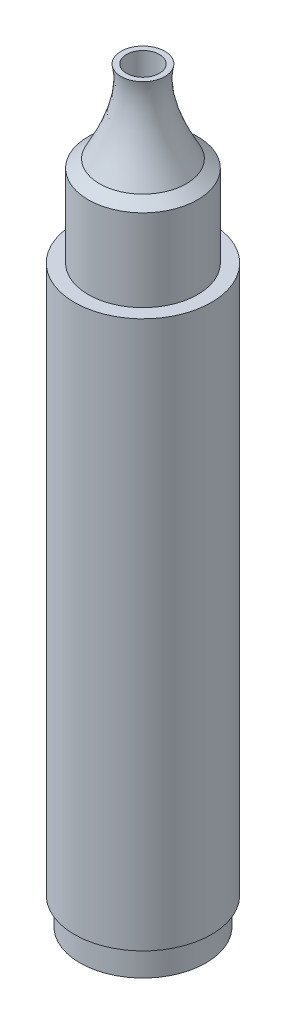
ISO-10303-21;
HEADER;
FILE_DESCRIPTION(('STEP AP214'),'2;1');
FILE_NAME('part.step','',(''),(''),'','','');
FILE_SCHEMA(('AUTOMOTIVE_DESIGN { 1 0 10303 214 1 1 1 1 }'));
ENDSEC;
DATA;
#1=APPLICATION_CONTEXT('core data for automotive mechanical design processes');
#2=APPLICATION_PROTOCOL_DEFINITION('international standard','automotive_design',2000,#1);
#3=PRODUCT_CONTEXT('',#1,'mechanical');
#4=PRODUCT('Part','Part','',(#3));
#5=PRODUCT_RELATED_PRODUCT_CATEGORY('part','',(#4));
#6=PRODUCT_DEFINITION_FORMATION('','',#4);
#7=PRODUCT_DEFINITION_CONTEXT('part definition',#1,'design');
#8=PRODUCT_DEFINITION('design','',#6,#7);
#9=PRODUCT_DEFINITION_SHAPE('','',#8);
#10=(LENGTH_UNIT() NAMED_UNIT(*) SI_UNIT(.MILLI.,.METRE.));
#11=(NAMED_UNIT(*) PLANE_ANGLE_UNIT() SI_UNIT($,.RADIAN.));
#12=(NAMED_UNIT(*) SI_UNIT($,.STERADIAN.) SOLID_ANGLE_UNIT());
#13=UNCERTAINTY_MEASURE_WITH_UNIT(LENGTH_MEASURE(1.E-05),#10,'distance_accuracy_value','');
#14=(GEOMETRIC_REPRESENTATION_CONTEXT(3) GLOBAL_UNCERTAINTY_ASSIGNED_CONTEXT((#13)) GLOBAL_UNIT_ASSIGNED_CONTEXT((#10,
#11,#12)) REPRESENTATION_CONTEXT('',''));
#15=CARTESIAN_POINT('',(0.,0.,0.));
#16=DIRECTION('',(0.,0.,1.));
#17=DIRECTION('',(1.,0.,0.));
#18=AXIS2_PLACEMENT_3D('',#15,#16,#17);
#19=CARTESIAN_POINT('',(0.,46.5,0.));
#20=DIRECTION('',(0.,1.,0.));
#21=DIRECTION('',(0.,0.,1.));
#22=AXIS2_PLACEMENT_3D('',#19,#20,#21);
#23=CYLINDRICAL_SURFACE('',#22,3.);
#24=CARTESIAN_POINT('',(0.,81.5,0.));
#25=DIRECTION('',(0.,1.,0.));
#26=DIRECTION('',(0.,0.,1.));
#27=AXIS2_PLACEMENT_3D('',#24,#25,#26);
#28=CIRCLE('',#27,3.);
#29=CARTESIAN_POINT('',(0.,81.5,3.));
#30=VERTEX_POINT('',#29);
#31=EDGE_CURVE('E152',#30,#30,#28,.T.);
#32=ORIENTED_EDGE('',*,*,#31,.T.);
#33=EDGE_LOOP('',(#32));
#34=FACE_BOUND('',#33,.T.);
#35=CARTESIAN_POINT('',(0.,50.,0.));
#36=DIRECTION('',(0.,-1.,0.));
#37=DIRECTION('',(0.,0.,-1.));
#38=AXIS2_PLACEMENT_3D('',#35,#36,#37);
#39=CIRCLE('',#38,3.);
#40=CARTESIAN_POINT('',(0.,50.,-3.));
#41=VERTEX_POINT('',#40);
#42=EDGE_CURVE('E107',#41,#41,#39,.F.);
#43=ORIENTED_EDGE('',*,*,#42,.F.);
#44=EDGE_LOOP('',(#43));
#45=FACE_BOUND('',#44,.T.);
#46=ADVANCED_FACE('F78',(#34,#45),#23,.F.);
#47=CARTESIAN_POINT('',(0.,50.,0.));
#48=DIRECTION('',(0.,-1.,0.));
#49=DIRECTION('',(0.,0.,-1.));
#50=AXIS2_PLACEMENT_3D('',#47,#48,#49);
#51=CYLINDRICAL_SURFACE('',#50,12.5);
#52=CARTESIAN_POINT('',(0.,50.,0.));
#53=DIRECTION('',(0.,1.,0.));
#54=DIRECTION('',(0.,0.,1.));
#55=AXIS2_PLACEMENT_3D('',#52,#53,#54);
#56=CIRCLE('',#55,12.5);
#57=CARTESIAN_POINT('',(0.,50.,12.5));
#58=VERTEX_POINT('',#57);
#59=EDGE_CURVE('E85',#58,#58,#56,.T.);
#60=ORIENTED_EDGE('',*,*,#59,.F.);
#61=EDGE_LOOP('',(#60));
#62=FACE_BOUND('',#61,.T.);
#63=CARTESIAN_POINT('',(0.,-50.,0.));
#64=DIRECTION('',(0.,1.,0.));
#65=DIRECTION('',(0.,0.,1.));
#66=AXIS2_PLACEMENT_3D('',#63,#64,#65);
#67=CIRCLE('',#66,12.5);
#68=CARTESIAN_POINT('',(0.,-50.,12.5));
#69=VERTEX_POINT('',#68);
#70=EDGE_CURVE('E89',#69,#69,#67,.T.);
#71=ORIENTED_EDGE('',*,*,#70,.T.);
#72=EDGE_LOOP('',(#71));
#73=FACE_BOUND('',#72,.T.);
#74=ADVANCED_FACE('F80',(#62,#73),#51,.T.);
#75=CARTESIAN_POINT('',(0.,50.,0.));
#76=DIRECTION('',(0.,1.,0.));
#77=DIRECTION('',(0.,0.,1.));
#78=AXIS2_PLACEMENT_3D('',#75,#76,#77);
#79=PLANE('',#78);
#80=CARTESIAN_POINT('',(0.,50.,0.));
#81=DIRECTION('',(0.,1.,0.));
#82=DIRECTION('',(0.,0.,1.));
#83=AXIS2_PLACEMENT_3D('',#80,#81,#82);
#84=CIRCLE('',#83,10.);
#85=CARTESIAN_POINT('',(0.,50.,10.));
#86=VERTEX_POINT('',#85);
#87=EDGE_CURVE('E97',#86,#86,#84,.T.);
#88=ORIENTED_EDGE('',*,*,#87,.F.);
#89=EDGE_LOOP('',(#88));
#90=FACE_BOUND('',#89,.T.);
#91=ORIENTED_EDGE('',*,*,#59,.T.);
#92=EDGE_LOOP('',(#91));
#93=FACE_BOUND('',#92,.T.);
#94=ADVANCED_FACE('F162',(#90,#93),#79,.T.);
#95=CARTESIAN_POINT('',(0.,-50.,0.));
#96=DIRECTION('',(0.,1.,0.));
#97=DIRECTION('',(0.,0.,1.));
#98=AXIS2_PLACEMENT_3D('',#95,#96,#97);
#99=PLANE('',#98);
#100=CARTESIAN_POINT('',(0.,-50.,0.));
#101=DIRECTION('',(0.,1.,0.));
#102=DIRECTION('',(0.,0.,1.));
#103=AXIS2_PLACEMENT_3D('',#100,#101,#102);
#104=CIRCLE('',#103,11.5);
#105=CARTESIAN_POINT('',(0.,-50.,11.5));
#106=VERTEX_POINT('',#105);
#107=EDGE_CURVE('E11',#106,#106,#104,.F.);
#108=ORIENTED_EDGE('',*,*,#107,.F.);
#109=EDGE_LOOP('',(#108));
#110=FACE_BOUND('',#109,.T.);
#111=ORIENTED_EDGE('',*,*,#70,.F.);
#112=EDGE_LOOP('',(#111));
#113=FACE_BOUND('',#112,.T.);
#114=ADVANCED_FACE('F164',(#110,#113),#99,.F.);
#115=CARTESIAN_POINT('',(0.,65.,0.));
#116=DIRECTION('',(0.,-1.,0.));
#117=DIRECTION('',(0.,0.,-1.));
#118=AXIS2_PLACEMENT_3D('',#115,#116,#117);
#119=CYLINDRICAL_SURFACE('',#118,10.);
#120=CARTESIAN_POINT('',(0.,65.,0.));
#121=DIRECTION('',(0.,1.,0.));
#122=DIRECTION('',(0.,0.,1.));
#123=AXIS2_PLACEMENT_3D('',#120,#121,#122);
#124=CIRCLE('',#123,10.);
#125=CARTESIAN_POINT('',(0.,65.,10.));
#126=VERTEX_POINT('',#125);
#127=EDGE_CURVE('E94',#126,#126,#124,.T.);
#128=ORIENTED_EDGE('',*,*,#127,.F.);
#129=EDGE_LOOP('',(#128));
#130=FACE_BOUND('',#129,.T.);
#131=ORIENTED_EDGE('',*,*,#87,.T.);
#132=EDGE_LOOP('',(#131));
#133=FACE_BOUND('',#132,.T.);
#134=ADVANCED_FACE('F160',(#130,#133),#119,.T.);
#135=CARTESIAN_POINT('',(0.,65.,0.));
#136=DIRECTION('',(0.,-1.,0.));
#137=DIRECTION('',(0.,0.,1.));
#138=AXIS2_PLACEMENT_3D('',#135,#136,#137);
#139=CONICAL_SURFACE('',#138,10.,0.942477796076939);
#140=CARTESIAN_POINT('',(5.60091406784511,66.4996844240338,-5.62206891748112));
#141=CARTESIAN_POINT('',(5.7591145441094,66.4996853382492,-5.46446421795488));
#142=CARTESIAN_POINT('',(5.9105040578577,66.4998265845282,-5.30005710016583));
#143=CARTESIAN_POINT('',(6.19895446938598,66.5000943482111,-4.95901121993968));
#144=CARTESIAN_POINT('',(6.33600997109026,66.5002208600702,-4.78236789245139));
#145=CARTESIAN_POINT('',(6.5950597171091,66.5003173375481,-4.41806353572599));
#146=CARTESIAN_POINT('',(6.71703603029525,66.5002871185922,-4.2303897736038));
#147=CARTESIAN_POINT('',(6.94485061121303,66.5001007442931,-3.84549548560347));
#148=CARTESIAN_POINT('',(7.05069173449653,66.4999446112645,-3.64827665713771));
#149=CARTESIAN_POINT('',(7.19661051800619,66.4997615489761,-3.34627075603501));
#150=CARTESIAN_POINT('',(7.24311906990382,66.4997090447501,-3.2445478238334));
#151=CARTESIAN_POINT('',(7.33171003320905,66.4996724322933,-3.03919262868534));
#152=CARTESIAN_POINT('',(7.37379246663426,66.4996883237222,-2.93556037523978));
#153=CARTESIAN_POINT('',(7.49332624256314,66.4998017968305,-2.62209669151953));
#154=CARTESIAN_POINT('',(7.56407809629994,66.4999651629713,-2.40966926897839));
#155=CARTESIAN_POINT('',(7.68747352367586,66.5002013768243,-1.97973975545691));
#156=CARTESIAN_POINT('',(7.74012375339314,66.5002742578342,-1.76223956124743));
#157=CARTESIAN_POINT('',(7.82709651023273,66.5002571539108,-1.32360738337499));
#158=CARTESIAN_POINT('',(7.86141924265363,66.5001671708018,-1.10247544042227));
#159=CARTESIAN_POINT('',(7.91132927635797,66.4999085315042,-0.658521822133398));
#160=CARTESIAN_POINT('',(7.92695410868064,66.4997400338609,-0.435704438147747));
#161=CARTESIAN_POINT('',(7.93606424311948,66.4996390938655,-0.101146418016441));
#162=CARTESIAN_POINT('',(7.93671256219778,66.499630753879,0.0104375058428037));
#163=CARTESIAN_POINT('',(7.93321673210212,66.4996788835062,0.233530553281766));
#164=CARTESIAN_POINT('',(7.9290725453627,66.4997353536278,0.345039676268311));
#165=CARTESIAN_POINT('',(7.90956046111363,66.4999258365794,0.679136457867865));
#166=CARTESIAN_POINT('',(7.88711450339323,66.500080939622,0.901349285266981));
#167=CARTESIAN_POINT('',(7.823754085219,66.5002622320344,1.34311723336023));
#168=CARTESIAN_POINT('',(7.78283755479337,66.5002884069514,1.56267205334259));
#169=CARTESIAN_POINT('',(7.68293511363978,66.5001866474977,1.99726279104118));
#170=CARTESIAN_POINT('',(7.62397886364519,66.5000589650927,2.21230551189636));
#171=CARTESIAN_POINT('',(7.48819265754146,66.4998021709668,2.63664829293196));
#172=CARTESIAN_POINT('',(7.41136532103142,66.4996730594581,2.84594918974475));
#173=CARTESIAN_POINT('',(7.24003038713968,66.4996928972499,3.25719093338214));
#174=CARTESIAN_POINT('',(7.14552227395217,66.4998418546637,3.45913156527844));
#175=CARTESIAN_POINT('',(6.93989009134385,66.5001088167002,3.85437155371327));
#176=CARTESIAN_POINT('',(6.82876502173701,66.5002268194586,4.04767038918577));
#177=CARTESIAN_POINT('',(6.59086421165636,66.5003062643202,4.42429964702583));
#178=CARTESIAN_POINT('',(6.4640927865921,66.5002677494992,4.60763279801652));
#179=CARTESIAN_POINT('',(6.1957006313774,66.5000711688183,4.9630953975899));
#180=CARTESIAN_POINT('',(6.05408174330833,66.4999131177738,5.13522623172667));
#181=CARTESIAN_POINT('',(5.83114756062265,66.4997363116131,5.38394770418094));
#182=CARTESIAN_POINT('',(5.75507313079763,66.4996874185148,5.46528709077041));
#183=CARTESIAN_POINT('',(5.59950350622633,66.4996602846937,5.62462284891057));
#184=CARTESIAN_POINT('',(5.52000839049419,66.4996820423396,5.70261929759654));
#185=CARTESIAN_POINT('',(5.27664068954301,66.499809332261,5.93142460479392));
#186=CARTESIAN_POINT('',(5.10786444102137,66.4999768700166,6.07707318181881));
#187=CARTESIAN_POINT('',(4.75874423859713,66.5002199991428,6.35375328074349));
#188=CARTESIAN_POINT('',(4.57839915303029,66.500295581504,6.48478336921742));
#189=CARTESIAN_POINT('',(4.20744690697763,66.5002838998007,6.73140394466579));
#190=CARTESIAN_POINT('',(4.01683985116027,66.5001966373968,6.84699458907524));
#191=CARTESIAN_POINT('',(3.62657973410753,66.4999432130856,7.06185300708897));
#192=CARTESIAN_POINT('',(3.42692601848646,66.4997770454625,7.1611195974889));
#193=CARTESIAN_POINT('',(3.1216918925127,66.4996795266755,7.29694860067313));
#194=CARTESIAN_POINT('',(3.01897930415511,66.499672315012,7.3400495553072));
#195=CARTESIAN_POINT('',(2.81180172802131,66.499720043337,7.42181193296226));
#196=CARTESIAN_POINT('',(2.70733672556573,66.4997749838465,7.46047331877321));
#197=CARTESIAN_POINT('',(2.39132810240221,66.4999586560924,7.56988646589907));
#198=CARTESIAN_POINT('',(2.17742885718066,66.5001061470163,7.63395269183543));
#199=CARTESIAN_POINT('',(1.74503926839508,66.5002709406097,7.74401153841586));
#200=CARTESIAN_POINT('',(1.52654841769384,66.500288228822,7.79000215146038));
#201=CARTESIAN_POINT('',(1.08647425073612,66.5001705608293,7.86362628622693));
#202=CARTESIAN_POINT('',(0.864890777365397,66.5000355968614,7.89125887181623));
#203=CARTESIAN_POINT('',(0.420204874269062,66.4997713353811,7.92774799910688));
#204=CARTESIAN_POINT('',(0.197102666956686,66.4996420370588,7.93660723317953));
#205=CARTESIAN_POINT('',(-0.249517758509706,66.4996625395985,7.93511763275345));
#206=CARTESIAN_POINT('',(-0.473035836691735,66.4998129427161,7.92472735021253));
#207=CARTESIAN_POINT('',(-0.918406973002969,66.500076529376,7.88516607179711));
#208=CARTESIAN_POINT('',(-1.14025992802748,66.5001897106319,7.85599392249524));
#209=CARTESIAN_POINT('',(-1.58075169014647,66.5002579449529,7.77924041918664));
#210=CARTESIAN_POINT('',(-1.79939046986408,66.500212996672,7.73165890847165));
#211=CARTESIAN_POINT('',(-2.23192138589389,66.5000089517572,7.61835224597021));
#212=CARTESIAN_POINT('',(-2.4458141325783,66.4998498698905,7.55262944206121));
#213=CARTESIAN_POINT('',(-2.7618880408733,66.4996858032014,7.44058864148263));
#214=CARTESIAN_POINT('',(-2.86648910425467,66.4996435385239,7.40098203203371));
#215=CARTESIAN_POINT('',(-3.07388133575936,66.4996352025511,7.31728978085394));
#216=CARTESIAN_POINT('',(-3.17667254412099,66.4996691295595,7.27320423885063));
#217=CARTESIAN_POINT('',(-3.48208126231317,66.4998333057142,7.13440589360862));
#218=CARTESIAN_POINT('',(-3.68176330231728,66.5000259420607,7.03314092145615));
#219=CARTESIAN_POINT('',(-4.07188510909359,66.5003220740096,6.81423234672576));
#220=CARTESIAN_POINT('',(-4.26232528943111,66.5004255736042,6.69658947795784));
#221=CARTESIAN_POINT('',(-4.63272159995574,66.5004692151503,6.44582523339415));
#222=CARTESIAN_POINT('',(-4.81267792399972,66.5004093601233,6.31270414394244));
#223=CARTESIAN_POINT('',(-5.16034342353349,66.5002069126255,6.03217076244711));
#224=CARTESIAN_POINT('',(-5.32808376829901,66.5000645396679,5.88479724782035));
#225=CARTESIAN_POINT('',(-5.56975518594777,66.4999964618234,5.65343771695007));
#226=CARTESIAN_POINT('',(-5.64866230595556,66.4999980226724,5.57459394879231));
#227=CARTESIAN_POINT('',(-5.80303347123787,66.5000516734901,5.41360458110039));
#228=CARTESIAN_POINT('',(-5.87849748861126,66.5001037638683,5.33145895481979));
#229=CARTESIAN_POINT('',(-6.0995628974415,66.5002664508266,5.08037628628315));
#230=CARTESIAN_POINT('',(-6.23988953821839,66.5003834925636,4.90674367947948));
#231=CARTESIAN_POINT('',(-6.50557528255518,66.500475043783,4.54839427914648));
#232=CARTESIAN_POINT('',(-6.6309328728887,66.5004495388678,4.36367636783124));
#233=CARTESIAN_POINT('',(-6.8658540778535,66.5002513390043,3.98438548783149));
#234=CARTESIAN_POINT('',(-6.97541405552374,66.5000786102249,3.7898102636636));
#235=CARTESIAN_POINT('',(-7.17769764423607,66.4997687744057,3.39211921879558));
#236=CARTESIAN_POINT('',(-7.27042362098109,66.4996316623594,3.18900460309532));
#237=CARTESIAN_POINT('',(-7.43805824716297,66.4996493976187,2.77555623076929));
#238=CARTESIAN_POINT('',(-7.51296707710465,66.4998042419663,2.56522254730432));
#239=CARTESIAN_POINT('',(-7.64486299031895,66.5000729219536,2.13898498315447));
#240=CARTESIAN_POINT('',(-7.70184736979923,66.5001867514067,1.92308026742364));
#241=CARTESIAN_POINT('',(-7.79751234689577,66.5002580668331,1.48784772505692));
#242=CARTESIAN_POINT('',(-7.83623993911061,66.5002159567135,1.26853020503904));
#243=CARTESIAN_POINT('',(-7.8952821263363,66.5000174583923,0.82742548864063));
#244=CARTESIAN_POINT('',(-7.91559916675671,66.499861085373,0.605638624217256));
#245=CARTESIAN_POINT('',(-7.93194861534551,66.4996993104151,0.272310664298952));
#246=CARTESIAN_POINT('',(-7.9350435272698,66.4996575154427,0.161077889935226));
#247=CARTESIAN_POINT('',(-7.93645613096223,66.4996462333445,-0.0614179710258914));
#248=CARTESIAN_POINT('',(-7.93477383148396,66.4996767460862,-0.172681057567367));
#249=CARTESIAN_POINT('',(-7.92263650875884,66.4998196889534,-0.506218599356346));
#250=CARTESIAN_POINT('',(-7.90509259510209,66.4999835177935,-0.728272953436864));
#251=CARTESIAN_POINT('',(-7.85151733563519,66.500212493124,-1.17033033321901));
#252=CARTESIAN_POINT('',(-7.81546761815298,66.5002775412953,-1.39033109881399));
#253=CARTESIAN_POINT('',(-7.72520752145986,66.5002483936348,-1.82657013854665));
#254=CARTESIAN_POINT('',(-7.67099755219411,66.5001542013975,-2.0428084975001));
#255=CARTESIAN_POINT('',(-7.54464650991213,66.4999007461533,-2.47003865849983));
#256=CARTESIAN_POINT('',(-7.47250403112207,66.4997414780443,-2.68103004779604));
#257=CARTESIAN_POINT('',(-7.35098221391389,66.499673180059,-2.99226003974664));
#258=CARTESIAN_POINT('',(-7.3082524476019,66.4996788563445,-3.09513627686821));
#259=CARTESIAN_POINT('',(-7.21843275334775,66.499745857756,-3.29896768403833));
#260=CARTESIAN_POINT('',(-7.17134278655687,66.4998071833778,-3.39992283696064));
#261=CARTESIAN_POINT('',(-7.02363665972135,66.5000031213156,-3.69988640723402));
#262=CARTESIAN_POINT('',(-6.91665791965379,66.5001496052638,-3.89580485668582));
#263=CARTESIAN_POINT('',(-6.68674618707552,66.5003034360181,-4.27803258808553));
#264=CARTESIAN_POINT('',(-6.56381157545815,66.5003107686927,-4.46434089216845));
#265=CARTESIAN_POINT('',(-6.30284219994142,66.500173424761,-4.82608867491291));
#266=CARTESIAN_POINT('',(-6.16480679556547,66.5000287417049,-5.00152769207587));
#267=CARTESIAN_POINT('',(-5.87443497920085,66.4997680472388,-5.34011385364277));
#268=CARTESIAN_POINT('',(-5.72210056362716,66.4996520318344,-5.50326270827156));
#269=CARTESIAN_POINT('',(-5.40362740343278,66.4996970368878,-5.81621744172798));
#270=CARTESIAN_POINT('',(-5.23745871433711,66.4998586739864,-5.96599284190109));
#271=CARTESIAN_POINT('',(-4.89309752713868,66.5001309320631,-6.2510566628087));
#272=CARTESIAN_POINT('',(-4.71490317982262,66.5002415451746,-6.38634284719059));
#273=CARTESIAN_POINT('',(-4.34785630268588,66.5003039404929,-6.64157232835317));
#274=CARTESIAN_POINT('',(-4.15900381280102,66.5002557232947,-6.76151568261763));
#275=CARTESIAN_POINT('',(-3.77191361124875,66.5000468505546,-6.98516916109));
#276=CARTESIAN_POINT('',(-3.57367716178603,66.4998862100946,-7.08888146044697));
#277=CARTESIAN_POINT('',(-3.2702010147941,66.4997256982868,-7.23154929202932));
#278=CARTESIAN_POINT('',(-3.16796168350263,66.4996856026248,-7.27697746960016));
#279=CARTESIAN_POINT('',(-2.96161772527312,66.4996787893386,-7.36337909015725));
#280=CARTESIAN_POINT('',(-2.85751309938622,66.4997120716731,-7.40435253565376));
#281=CARTESIAN_POINT('',(-2.54271079697558,66.4998585732858,-7.52055417671518));
#282=CARTESIAN_POINT('',(-2.32949669795713,66.5000184434857,-7.5890768178004));
#283=CARTESIAN_POINT('',(-1.89813066136552,66.5002308491336,-7.7079912023762));
#284=CARTESIAN_POINT('',(-1.67997921801279,66.5002833952772,-7.75838475210337));
#285=CARTESIAN_POINT('',(-1.24023044296721,66.5002293777663,-7.84078150453935));
#286=CARTESIAN_POINT('',(-1.01863323211878,66.5001228196794,-7.87278535069497));
#287=CARTESIAN_POINT('',(-0.574016575630578,66.4998485719535,-7.91799458443638));
#288=CARTESIAN_POINT('',(-0.351001371671045,66.4996810183518,-7.93124148636984));
#289=CARTESIAN_POINT('',(0.0953395341605491,66.4996180750387,-7.93851824483944));
#290=CARTESIAN_POINT('',(0.318665226464053,66.499722677118,-7.93254868101366));
#291=CARTESIAN_POINT('',(0.764032953787446,66.4999781170766,-7.90174483026842));
#292=CARTESIAN_POINT('',(0.986074791485171,66.5001289618803,-7.87690771728392));
#293=CARTESIAN_POINT('',(1.42732656063888,66.5002832704799,-7.80880229522759));
#294=CARTESIAN_POINT('',(1.64653628805385,66.5002867237153,-7.76553266571998));
#295=CARTESIAN_POINT('',(2.0803032038946,66.5001457408847,-7.66093122854478));
#296=CARTESIAN_POINT('',(2.29486610096011,66.5000014981852,-7.59962311202191));
#297=CARTESIAN_POINT('',(2.71804582953167,66.4997588076471,-7.45910194286253));
#298=CARTESIAN_POINT('',(2.92666297394793,66.4996603573943,-7.37988983443539));
#299=CARTESIAN_POINT('',(3.33611419893469,66.4997285008074,-7.20394838168585));
#300=CARTESIAN_POINT('',(3.53695625232518,66.499894815182,-7.10723759148258));
#301=CARTESIAN_POINT('',(3.92978748742622,66.5001637716961,-6.89737567006175));
#302=CARTESIAN_POINT('',(4.12177813622267,66.5002664244227,-6.78422727631202));
#303=CARTESIAN_POINT('',(4.54138980540214,66.500313554709,-6.51280784578172));
#304=CARTESIAN_POINT('',(4.76626387883413,66.5002132887,-6.35026509785265));
#305=CARTESIAN_POINT('',(5.19789053656137,66.4998981535069,-6.00266055991615));
#306=CARTESIAN_POINT('',(5.40464398954863,66.4996832898201,-5.81759985042364));
#307=CARTESIAN_POINT('',(5.60091406784511,66.4996844240338,-5.62206891748112));
#308=B_SPLINE_CURVE_WITH_KNOTS('',3,(#140,#141,#142,#143,#144,#145,#146,#147,#148,#149,#150,
#151,#152,#153,#154,#155,#156,#157,#158,#159,#160,#161,#162,#163,#164,#165,#166,#167,#168,#169,
#170,#171,#172,#173,#174,#175,#176,#177,#178,#179,#180,#181,#182,#183,#184,#185,#186,#187,#188,
#189,#190,#191,#192,#193,#194,#195,#196,#197,#198,#199,#200,#201,#202,#203,#204,#205,#206,#207,
#208,#209,#210,#211,#212,#213,#214,#215,#216,#217,#218,#219,#220,#221,#222,#223,#224,#225,#226,
#227,#228,#229,#230,#231,#232,#233,#234,#235,#236,#237,#238,#239,#240,#241,#242,#243,#244,#245,
#246,#247,#248,#249,#250,#251,#252,#253,#254,#255,#256,#257,#258,#259,#260,#261,#262,#263,#264,
#265,#266,#267,#268,#269,#270,#271,#272,#273,#274,#275,#276,#277,#278,#279,#280,#281,#282,#283,
#284,#285,#286,#287,#288,#289,#290,#291,#292,#293,#294,#295,#296,#297,#298,#299,#300,#301,#302,
#303,#304,#305,#306,#307),.UNSPECIFIED.,.T.,.F.,(4,2,2,2,2,2,2,2,2,2,2,2,2,2,2,2,2,2,2,2,2,2,2,
2,2,2,2,2,2,2,2,2,2,2,2,2,2,2,2,2,2,2,2,2,2,2,2,2,2,2,2,2,2,2,2,2,2,2,2,2,2,2,2,2,2,2,2,2,2,2,2,
2,2,2,2,2,2,2,2,2,2,2,2,4),(0.,0.669688548150085,1.33962830163774,2.0103571909175,
2.68096723869655,3.01643033440647,3.35189176128431,4.02271809958189,4.69329750644624,
5.36386940154381,6.03309303283826,6.36776031527755,6.70243022098407,7.37160325358462,
8.04085129811557,8.70900483100335,9.37706048552979,10.0451356324542,10.713251007479,
11.3811825201774,12.0490312624095,12.383054712931,12.7170704520092,13.3850065055847,
14.0530079966285,14.7210026755845,15.3890457509846,15.723123954516,16.0572049579044,
16.7262110103299,17.3952913460986,18.0644057977294,18.7334242821319,19.4038849710556,
20.0743868380737,20.7448944128123,21.4153152499591,21.7507705579493,22.0862183983548,
22.7570206824554,23.4277929209952,24.0985527523534,24.7675363723124,25.1020869871245,
25.4366403124815,26.1055319473334,26.7744911435261,27.4436041039128,28.1126229601173,
28.7816350382288,29.4507479843283,30.1181290403008,30.7854214373692,31.1191604528959,
31.4528988568918,32.1202810166161,32.7883270062469,33.4563579165832,34.1244412120413,
34.458543445356,34.7926486557577,35.4614630614155,36.1303453875083,36.7992560942103,
37.4680735467287,38.1383783025248,38.8087863685373,39.4791919227118,40.1495075577148,
40.4850503144123,40.8205928820284,41.4915855409789,42.1625113291001,42.8334136404236,
43.5028287243407,44.1722236164676,44.841718793299,45.5112619383001,46.1799296234088,
46.8485620529701,47.5164896322431,48.1843061041603,49.0151893719312,49.846032785829),.UNSPECIFIED.);
#309=CARTESIAN_POINT('',(5.60091406784511,66.4996844240338,-5.62206891748112));
#310=VERTEX_POINT('',#309);
#311=EDGE_CURVE('E100',#310,#310,#308,.F.);
#312=ORIENTED_EDGE('',*,*,#311,.F.);
#313=EDGE_LOOP('',(#312));
#314=FACE_BOUND('',#313,.T.);
#315=ORIENTED_EDGE('',*,*,#127,.T.);
#316=EDGE_LOOP('',(#315));
#317=FACE_BOUND('',#316,.T.);
#318=ADVANCED_FACE('F108',(#314,#317),#139,.T.);
#319=CARTESIAN_POINT('',(0.,81.5,0.));
#320=DIRECTION('',(0.,1.,0.));
#321=DIRECTION('',(0.,0.,1.));
#322=AXIS2_PLACEMENT_3D('',#319,#320,#321);
#323=PLANE('',#322);
#324=ORIENTED_EDGE('',*,*,#31,.F.);
#325=EDGE_LOOP('',(#324));
#326=FACE_BOUND('',#325,.T.);
#327=CARTESIAN_POINT('',(0.,81.5,0.));
#328=DIRECTION('',(0.,1.,0.));
#329=DIRECTION('',(0.,0.,1.));
#330=AXIS2_PLACEMENT_3D('',#327,#328,#329);
#331=CIRCLE('',#330,4.);
#332=CARTESIAN_POINT('',(0.,81.5,4.));
#333=VERTEX_POINT('',#332);
#334=EDGE_CURVE('E106',#333,#333,#331,.T.);
#335=ORIENTED_EDGE('',*,*,#334,.T.);
#336=EDGE_LOOP('',(#335));
#337=FACE_BOUND('',#336,.T.);
#338=ADVANCED_FACE('F118',(#326,#337),#323,.T.);
#339=CARTESIAN_POINT('',(-5.66309340763002,66.3581561390055,5.66688134563738));
#340=CARTESIAN_POINT('',(-5.64226477620512,66.4054374260037,5.65184129878551));
#341=CARTESIAN_POINT('',(-5.62143614478021,66.4527187130018,5.63680125193365));
#342=CARTESIAN_POINT('',(-5.60060751335531,66.5,5.62176120508178));
#343=CARTESIAN_POINT('',(-4.17851845435212,69.7281622140235,4.59489171766246));
#344=CARTESIAN_POINT('',(-2.23219059705252,74.5995134645238,3.26010513509654));
#345=CARTESIAN_POINT('',(-1.51612942389276,79.7281622140235,3.28904226627915));
#346=CARTESIAN_POINT('',(-1.60702396766627,81.5,3.66298702800681));
#347=CARTESIAN_POINT('',(-4.92130133334688,66.3581561486954,6.4081773391556));
#348=CARTESIAN_POINT('',(-4.90244113455685,66.4054374324636,6.39041121605575));
#349=CARTESIAN_POINT('',(-4.88358093576683,66.4527187162318,6.37264509295591));
#350=CARTESIAN_POINT('',(-4.8647207369768,66.5,6.35487896985606));
#351=CARTESIAN_POINT('',(-3.57702776268692,69.7281619934948,5.14188476174929));
#352=CARTESIAN_POINT('',(-1.80545595642946,74.5995137530643,3.55228866187105));
#353=CARTESIAN_POINT('',(-1.0855880741742,79.7281619934947,3.48750630389559));
#354=CARTESIAN_POINT('',(-1.1275401159652,81.5,3.87334596073059));
#355=CARTESIAN_POINT('',(-3.14351165133601,66.3581566850909,7.59573629921473));
#356=CARTESIAN_POINT('',(-3.12967144614976,66.4054377900606,7.57330002197619));
#357=CARTESIAN_POINT('',(-3.11583124096352,66.4527188950302,7.55086374473765));
#358=CARTESIAN_POINT('',(-3.10199103577727,66.4999999999999,7.52842746749911));
#359=CARTESIAN_POINT('',(-2.15704155886695,69.7281497859012,5.99657529081013));
#360=CARTESIAN_POINT('',(-0.835977237223488,74.5995297255192,3.96699906214454));
#361=CARTESIAN_POINT('',(-0.145806907025956,79.7281497859012,3.71326753825199));
#362=CARTESIAN_POINT('',(-0.0851488451030851,81.4999999999999,4.10344974470634));
#363=CARTESIAN_POINT('',(0.00291737979356037,66.3581564258347,8.22037347204571));
#364=CARTESIAN_POINT('',(0.00711635998792865,66.4054376172232,8.19434912958628));
#365=CARTESIAN_POINT('',(0.0113153401822969,66.4527188086117,8.16832478712685));
#366=CARTESIAN_POINT('',(0.0155143203766652,66.5000000000002,8.14230044466742));
#367=CARTESIAN_POINT('',(0.30220256558912,69.7281556862082,6.36547066049547));
#368=CARTESIAN_POINT('',(0.74581491905011,74.5995220055389,3.98485791020702));
#369=CARTESIAN_POINT('',(1.28632784416492,79.728155686208,3.48632188257671));
#370=CARTESIAN_POINT('',(1.49170486068217,81.4999999999999,3.82358159015112));
#371=CARTESIAN_POINT('',(3.14828020708932,66.3581564007362,7.59355874775675));
#372=CARTESIAN_POINT('',(3.14220148103106,66.4054376004908,7.56790850775491));
#373=CARTESIAN_POINT('',(3.13612275497281,66.4527188002453,7.54225826775307));
#374=CARTESIAN_POINT('',(3.13004402891456,66.4999999999998,7.51660802775122));
#375=CARTESIAN_POINT('',(2.71501484894726,69.7281562574046,5.76532034478735));
#376=CARTESIAN_POINT('',(2.21394409266803,74.599521258183,3.39616664795405));
#377=CARTESIAN_POINT('',(2.52254799782892,79.7281562574047,2.72873779567609));
#378=CARTESIAN_POINT('',(2.84134304955714,81.5,2.96173304859251));
#379=CARTESIAN_POINT('',(5.81465149857619,66.3581564647922,5.81072530216836));
#380=CARTESIAN_POINT('',(5.79921922950841,66.4054376431948,5.78935366959923));
#381=CARTESIAN_POINT('',(5.78378696044064,66.4527188215975,5.7679820370301));
#382=CARTESIAN_POINT('',(5.76835469137286,66.5000000000001,5.74661040446097));
#383=CARTESIAN_POINT('',(4.71470596385057,69.7281547995901,4.28744757087895));
#384=CARTESIAN_POINT('',(3.34510541820296,74.5995231655924,2.29037100086496));
#385=CARTESIAN_POINT('',(3.37479613428689,79.72815479959,1.55564520620887));
#386=CARTESIAN_POINT('',(3.75849013530521,81.5000000000001,1.64890716706131));
#387=CARTESIAN_POINT('',(7.59562693765021,66.3581563923314,3.14326197377403));
#388=CARTESIAN_POINT('',(7.57319119597999,66.4054375948876,3.12942275881517));
#389=CARTESIAN_POINT('',(7.55075545430977,66.4527187974437,3.11558354385632));
#390=CARTESIAN_POINT('',(7.52831971263955,66.4999999999999,3.10174432889747));
#391=CARTESIAN_POINT('',(5.99650410224374,69.7281564486875,2.15686246043979));
#392=CARTESIAN_POINT('',(3.96694770506874,74.5995210079083,0.835922540181895));
#393=CARTESIAN_POINT('',(3.7132167137524,79.7281564486875,0.145762493868395));
#394=CARTESIAN_POINT('',(4.10338857947097,81.4999999999998,0.0850942961103478));
#395=CARTESIAN_POINT('',(8.22042175670636,66.3581565693533,-0.00268850653655433));
#396=CARTESIAN_POINT('',(8.1943972437015,66.4054377129023,-0.00688886925804698));
#397=CARTESIAN_POINT('',(8.16837273069664,66.4527188564512,-0.0110892319795396));
#398=CARTESIAN_POINT('',(8.14234821769178,66.5000000000001,-0.0152895947010323));
#399=CARTESIAN_POINT('',(6.3655067894138,69.7281524199273,-0.302072232898664));
#400=CARTESIAN_POINT('',(3.98488447739385,74.5995262791507,-0.745820129090541));
#401=CARTESIAN_POINT('',(3.48634662146285,79.7281524199273,-1.28635170451965));
#402=CARTESIAN_POINT('',(3.82360797921378,81.5,-1.49170878001784));
#403=CARTESIAN_POINT('',(7.59354209833435,66.3581564092704,-3.14835859346703));
#404=CARTESIAN_POINT('',(7.56789179561107,66.4054376061803,-3.14227940647923));
#405=CARTESIAN_POINT('',(7.54224149288779,66.4527188030901,-3.13620021949142));
#406=CARTESIAN_POINT('',(7.51659119016452,66.5,-3.13012103250361));
#407=CARTESIAN_POINT('',(5.76529922485167,69.7281560631827,-2.71506038225565));
#408=CARTESIAN_POINT('',(3.39613716446202,74.5995215123042,-2.21394453716625));
#409=CARTESIAN_POINT('',(2.72870805795947,79.7281560631827,-2.52253968885942));
#410=CARTESIAN_POINT('',(2.96170443646412,81.5,-2.84133999793794));
#411=CARTESIAN_POINT('',(5.81071817055613,66.3581564162687,-5.81460482551826));
#412=CARTESIAN_POINT('',(5.78934666217507,66.4054376108457,-5.79917280690199));
#413=CARTESIAN_POINT('',(5.76797515379402,66.4527188054228,-5.78374078828572));
#414=CARTESIAN_POINT('',(5.74660364541296,66.4999999999999,-5.76830876966946));
#415=CARTESIAN_POINT('',(4.28744929085658,69.728155903909,-4.71467714189535));
#416=CARTESIAN_POINT('',(2.29038570408648,74.5995217206979,-3.34510090468608));
#417=CARTESIAN_POINT('',(1.55566138293938,79.7281559039091,-3.37479613308697));
#418=CARTESIAN_POINT('',(1.64892178353717,81.5,-3.75848725645689));
#419=CARTESIAN_POINT('',(3.14328034192168,66.3581564493661,-7.59564581748236));
#420=CARTESIAN_POINT('',(3.12944088643293,66.4054376329108,-7.57320988725571));
#421=CARTESIAN_POINT('',(3.11560143094418,66.4527188164555,-7.55077395702905));
#422=CARTESIAN_POINT('',(3.10176197545543,66.5000000000001,-7.52833802680239));
#423=CARTESIAN_POINT('',(2.15686368465439,69.728155150666,-5.99650954258706));
#424=CARTESIAN_POINT('',(0.835901080860814,74.5995227062435,-3.96693451584572));
#425=CARTESIAN_POINT('',(0.145740181709751,79.7281551506659,-3.7131993762281));
#426=CARTESIAN_POINT('',(0.0850767244005802,81.5,-4.10337277173529));
#427=CARTESIAN_POINT('',(-0.00280836013522394,66.3581565034902,-8.22042141104388));
#428=CARTESIAN_POINT('',(-0.00700769704058541,66.4054376689935,-8.19439693988715));
#429=CARTESIAN_POINT('',(-0.0112070339459469,66.4527188344967,-8.16837246873043));
#430=CARTESIAN_POINT('',(-0.0154063708513084,66.4999999999999,-8.1423479975737));
#431=CARTESIAN_POINT('',(-0.302118970750843,69.7281539188746,-6.36550942650572));
#432=CARTESIAN_POINT('',(-0.745773133128862,74.5995243179238,-3.98489303476509));
#433=CARTESIAN_POINT('',(-1.28629313956425,79.7281539188746,-3.48636010000078));
#434=CARTESIAN_POINT('',(-1.49166763751984,81.4999999999999,-3.82362402993096));
#435=CARTESIAN_POINT('',(-3.1483400958476,66.3581563798119,-7.59352342185653));
#436=CARTESIAN_POINT('',(-3.14226116957455,66.4054375865413,-7.56787326212354));
#437=CARTESIAN_POINT('',(-3.1361822433015,66.4527187932706,-7.54222310239055));
#438=CARTESIAN_POINT('',(-3.13010331702845,66.5,-7.51657294265757));
#439=CARTESIAN_POINT('',(-2.71506046725877,69.7281567336166,-5.76529074010471));
#440=CARTESIAN_POINT('',(-2.21396884858404,74.5995206351055,-3.39614218174308));
#441=CARTESIAN_POINT('',(-2.5225673776533,79.7281567336167,-2.72871161276924));
#442=CARTESIAN_POINT('',(-2.84136363218866,81.5000000000002,-2.96170416872433));
#443=CARTESIAN_POINT('',(-5.81461209084499,66.358156464116,-5.8107647325229));
#444=CARTESIAN_POINT('',(-5.79917996115991,66.4054376427439,-5.7893930021183));
#445=CARTESIAN_POINT('',(-5.78374783147483,66.4527188213719,-5.7680212717137));
#446=CARTESIAN_POINT('',(-5.76831570178976,66.4999999999999,-5.7466495413091));
#447=CARTESIAN_POINT('',(-4.7146764907166,69.728154814973,-4.28748002794343));
#448=CARTESIAN_POINT('',(-3.34508924235885,74.5995231454658,-2.29039470259929));
#449=CARTESIAN_POINT('',(-3.37478486464982,79.728154814973,-1.55566932725356));
#450=CARTESIAN_POINT('',(-3.75847845096747,81.4999999999998,-1.64893379987977));
#451=CARTESIAN_POINT('',(-7.59566221269738,66.3581564141023,-3.14320207566935));
#452=CARTESIAN_POINT('',(-7.57322633312275,66.4054376094015,-3.12936302009205));
#453=CARTESIAN_POINT('',(-7.55079045354812,66.4527188047008,-3.11552396451476));
#454=CARTESIAN_POINT('',(-7.5283545739735,66.5000000000001,-3.10168490893746));
#455=CARTESIAN_POINT('',(-5.99652954806028,69.7281559532181,-2.1568139223646));
#456=CARTESIAN_POINT('',(-3.96696141469275,74.5995216561814,-0.835890512082522));
#457=CARTESIAN_POINT('',(-3.71322422815381,79.7281559532183,-0.145731149494574));
#458=CARTESIAN_POINT('',(-4.10339589143387,81.5000000000002,-0.0850595941405917));
#459=CARTESIAN_POINT('',(-8.22037395252164,66.3581564949177,0.00257948426742134));
#460=CARTESIAN_POINT('',(-8.19434965904196,66.4054376632785,0.00678014506927305));
#461=CARTESIAN_POINT('',(-8.16832536556227,66.4527188316392,0.0109808058711248));
#462=CARTESIAN_POINT('',(-8.14230107208258,66.4999999999999,0.0151814666729765));
#463=CARTESIAN_POINT('',(-6.36547463203613,69.7281541139711,0.301984456511034));
#464=CARTESIAN_POINT('',(-3.98486738184669,74.5995240626592,0.745768157890005));
#465=CARTESIAN_POINT('',(-3.48634014128002,79.7281541139709,1.2863014544119));
#466=CARTESIAN_POINT('',(-3.82360195839023,81.4999999999997,1.49165265116243));
#467=CARTESIAN_POINT('',(-7.59363216967715,66.3581566269515,3.14858988763241));
#468=CARTESIAN_POINT('',(-7.56798136868164,66.405437751301,3.14251006788176));
#469=CARTESIAN_POINT('',(-7.54233056768614,66.4527188756505,3.1364302481311));
#470=CARTESIAN_POINT('',(-7.51667976669063,66.5,3.13035042838045));
#471=CARTESIAN_POINT('',(-5.76535378150047,69.7281511090739,2.71524657581612));
#472=CARTESIAN_POINT('',(-3.39616785291832,74.5995279942755,2.21403962591435));
#473=CARTESIAN_POINT('',(-2.72871528523912,79.728151109074,2.52263235439702));
#474=CARTESIAN_POINT('',(-2.9617122352113,81.5000000000002,2.84144519020736));
#475=CARTESIAN_POINT('',(-6.40488548191316,66.3581561293156,4.92558535211916));
#476=CARTESIAN_POINT('',(-6.38208841785338,66.4054374195437,4.91327138151527));
#477=CARTESIAN_POINT('',(-6.3592913537936,66.4527187097719,4.90095741091139));
#478=CARTESIAN_POINT('',(-6.33649428973382,66.5,4.8886434403075));
#479=CARTESIAN_POINT('',(-4.78000914601733,69.7281624345522,4.04789867357562));
#480=CARTESIAN_POINT('',(-2.65892523767558,74.5995131759832,2.96792160832203));
#481=CARTESIAN_POINT('',(-1.94667077361132,79.7281624345522,3.0905782286627));
#482=CARTESIAN_POINT('',(-2.08650781936734,81.5,3.45262809528303));
#483=CARTESIAN_POINT('',(-5.66309340763002,66.3581561390055,5.66688134563738));
#484=CARTESIAN_POINT('',(-5.64226477620512,66.4054374260037,5.65184129878551));
#485=CARTESIAN_POINT('',(-5.62143614478021,66.4527187130018,5.63680125193365));
#486=CARTESIAN_POINT('',(-5.60060751335531,66.5,5.62176120508178));
#487=CARTESIAN_POINT('',(-4.17851845435212,69.7281622140235,4.59489171766246));
#488=CARTESIAN_POINT('',(-2.23219059705252,74.5995134645238,3.26010513509654));
#489=CARTESIAN_POINT('',(-1.51612942389276,79.7281622140235,3.28904226627915));
#490=CARTESIAN_POINT('',(-1.60702396766627,81.5,3.66298702800681));
#491=B_SPLINE_SURFACE_WITH_KNOTS('',3,3,((#339,#340,#341,#342,#343,#344,#345,#346),(#347,#348,
#349,#350,#351,#352,#353,#354),(#355,#356,#357,#358,#359,#360,#361,#362),(#363,#364,#365,#366,
#367,#368,#369,#370),(#371,#372,#373,#374,#375,#376,#377,#378),(#379,#380,#381,#382,#383,#384,
#385,#386),(#387,#388,#389,#390,#391,#392,#393,#394),(#395,#396,#397,#398,#399,#400,#401,#402),
(#403,#404,#405,#406,#407,#408,#409,#410),(#411,#412,#413,#414,#415,#416,#417,#418),(#419,#420,
#421,#422,#423,#424,#425,#426),(#427,#428,#429,#430,#431,#432,#433,#434),(#435,#436,#437,#438,
#439,#440,#441,#442),(#443,#444,#445,#446,#447,#448,#449,#450),(#451,#452,#453,#454,#455,#456,
#457,#458),(#459,#460,#461,#462,#463,#464,#465,#466),(#467,#468,#469,#470,#471,#472,#473,#474),
(#475,#476,#477,#478,#479,#480,#481,#482),(#483,#484,#485,#486,#487,#488,#489,#490)),
.UNSPECIFIED.,.T.,.F.,.F.,(4,1,1,1,1,1,1,1,1,1,1,1,1,1,1,1,4),(4,3,1,4),(0.,0.0625,0.125,0.1875,
0.25,0.3125,0.375,0.4375,0.5,0.5625,0.625,0.6875,0.75,0.8125,0.875,0.9375,1.),(-0.01,0.,
0.682756840808548,1.),.UNSPECIFIED.);
#492=ORIENTED_EDGE('',*,*,#311,.T.);
#493=EDGE_LOOP('',(#492));
#494=FACE_BOUND('',#493,.T.);
#495=ORIENTED_EDGE('',*,*,#334,.F.);
#496=EDGE_LOOP('',(#495));
#497=FACE_BOUND('',#496,.T.);
#498=ADVANCED_FACE('F111',(#494,#497),#491,.T.);
#499=CARTESIAN_POINT('',(0.,50.,0.));
#500=DIRECTION('',(0.,-1.,0.));
#501=DIRECTION('',(0.,0.,-1.));
#502=AXIS2_PLACEMENT_3D('',#499,#500,#501);
#503=PLANE('',#502);
#504=CARTESIAN_POINT('',(0.,50.,0.));
#505=DIRECTION('',(0.,-1.,0.));
#506=DIRECTION('',(0.,0.,-1.));
#507=AXIS2_PLACEMENT_3D('',#504,#505,#506);
#508=CIRCLE('',#507,8.19920411883331);
#509=CARTESIAN_POINT('',(0.,50.,-8.19920411883331));
#510=VERTEX_POINT('',#509);
#511=EDGE_CURVE('E205',#510,#510,#508,.T.);
#512=ORIENTED_EDGE('',*,*,#511,.T.);
#513=EDGE_LOOP('',(#512));
#514=FACE_BOUND('',#513,.T.);
#515=ORIENTED_EDGE('',*,*,#42,.T.);
#516=EDGE_LOOP('',(#515));
#517=FACE_BOUND('',#516,.T.);
#518=ADVANCED_FACE('F117',(#514,#517),#503,.T.);
#519=CARTESIAN_POINT('',(0.,50.,0.));
#520=DIRECTION('',(0.,-1.,0.));
#521=DIRECTION('',(0.,0.,-1.));
#522=AXIS2_PLACEMENT_3D('',#519,#520,#521);
#523=CYLINDRICAL_SURFACE('',#522,8.19920411883331);
#524=ORIENTED_EDGE('',*,*,#511,.F.);
#525=EDGE_LOOP('',(#524));
#526=FACE_BOUND('',#525,.T.);
#527=CARTESIAN_POINT('',(0.,-50.,0.));
#528=DIRECTION('',(0.,-1.,0.));
#529=DIRECTION('',(0.,0.,-1.));
#530=AXIS2_PLACEMENT_3D('',#527,#528,#529);
#531=CIRCLE('',#530,8.19920411883331);
#532=CARTESIAN_POINT('',(0.,-50.,-8.19920411883331));
#533=VERTEX_POINT('',#532);
#534=EDGE_CURVE('E202',#533,#533,#531,.F.);
#535=ORIENTED_EDGE('',*,*,#534,.F.);
#536=EDGE_LOOP('',(#535));
#537=FACE_BOUND('',#536,.T.);
#538=ADVANCED_FACE('F179',(#526,#537),#523,.F.);
#539=CARTESIAN_POINT('',(0.,-50.,0.));
#540=DIRECTION('',(0.,-1.,0.));
#541=DIRECTION('',(0.,0.,-1.));
#542=AXIS2_PLACEMENT_3D('',#539,#540,#541);
#543=PLANE('',#542);
#544=ORIENTED_EDGE('',*,*,#534,.T.);
#545=EDGE_LOOP('',(#544));
#546=FACE_BOUND('',#545,.T.);
#547=ADVANCED_FACE('F182',(#546),#543,.F.);
#548=CARTESIAN_POINT('',(0.,-55.,0.));
#549=DIRECTION('',(0.,1.,0.));
#550=DIRECTION('',(0.,0.,1.));
#551=AXIS2_PLACEMENT_3D('',#548,#549,#550);
#552=CYLINDRICAL_SURFACE('',#551,11.5);
#553=CARTESIAN_POINT('',(0.,-55.,0.));
#554=DIRECTION('',(0.,-1.,0.));
#555=DIRECTION('',(0.,0.,-1.));
#556=AXIS2_PLACEMENT_3D('',#553,#554,#555);
#557=CIRCLE('',#556,11.5);
#558=CARTESIAN_POINT('',(0.,-55.,-11.5));
#559=VERTEX_POINT('',#558);
#560=EDGE_CURVE('E201',#559,#559,#557,.T.);
#561=ORIENTED_EDGE('',*,*,#560,.F.);
#562=EDGE_LOOP('',(#561));
#563=FACE_BOUND('',#562,.T.);
#564=ORIENTED_EDGE('',*,*,#107,.T.);
#565=EDGE_LOOP('',(#564));
#566=FACE_BOUND('',#565,.T.);
#567=ADVANCED_FACE('F187',(#563,#566),#552,.T.);
#568=CARTESIAN_POINT('',(0.,-55.,0.));
#569=DIRECTION('',(0.,-1.,0.));
#570=DIRECTION('',(0.,0.,-1.));
#571=AXIS2_PLACEMENT_3D('',#568,#569,#570);
#572=PLANE('',#571);
#573=ORIENTED_EDGE('',*,*,#560,.T.);
#574=EDGE_LOOP('',(#573));
#575=FACE_BOUND('',#574,.T.);
#576=ADVANCED_FACE('F190',(#575),#572,.T.);
#577=CLOSED_SHELL('',(#46,#74,#94,#114,#134,#318,#338,#498,#518,#538,#547,#567,#576));
#578=MANIFOLD_SOLID_BREP('B2',#577);
#579=ADVANCED_BREP_SHAPE_REPRESENTATION('',(#18,#578),#14);
#580=SHAPE_DEFINITION_REPRESENTATION(#9,#579);
ENDSEC;
END-ISO-10303-21;
